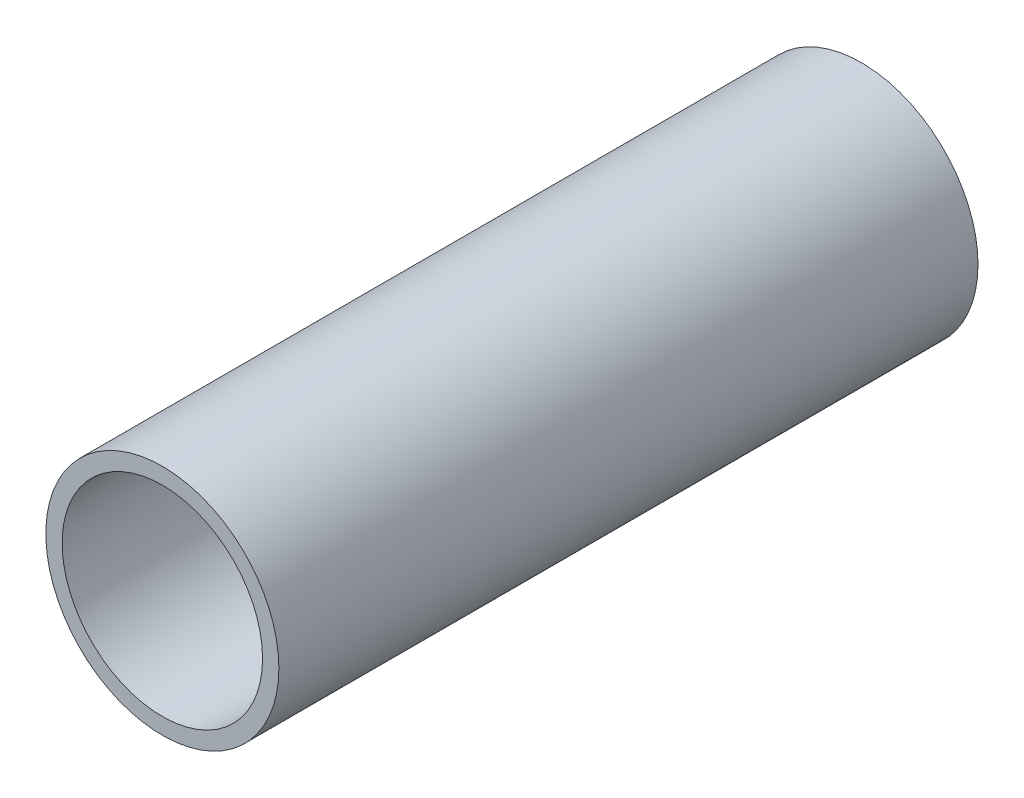
ISO-10303-21;
HEADER;
FILE_DESCRIPTION(('STEP AP214'),'2;1');
FILE_NAME('part.step','',(''),(''),'','','');
FILE_SCHEMA(('AUTOMOTIVE_DESIGN { 1 0 10303 214 1 1 1 1 }'));
ENDSEC;
DATA;
#1=APPLICATION_CONTEXT('core data for automotive mechanical design processes');
#2=APPLICATION_PROTOCOL_DEFINITION('international standard','automotive_design',2000,#1);
#3=PRODUCT_CONTEXT('',#1,'mechanical');
#4=PRODUCT('Part','Part','',(#3));
#5=PRODUCT_RELATED_PRODUCT_CATEGORY('part','',(#4));
#6=PRODUCT_DEFINITION_FORMATION('','',#4);
#7=PRODUCT_DEFINITION_CONTEXT('part definition',#1,'design');
#8=PRODUCT_DEFINITION('design','',#6,#7);
#9=PRODUCT_DEFINITION_SHAPE('','',#8);
#10=(LENGTH_UNIT() NAMED_UNIT(*) SI_UNIT(.MILLI.,.METRE.));
#11=(NAMED_UNIT(*) PLANE_ANGLE_UNIT() SI_UNIT($,.RADIAN.));
#12=(NAMED_UNIT(*) SI_UNIT($,.STERADIAN.) SOLID_ANGLE_UNIT());
#13=UNCERTAINTY_MEASURE_WITH_UNIT(LENGTH_MEASURE(1.E-05),#10,'distance_accuracy_value','');
#14=(GEOMETRIC_REPRESENTATION_CONTEXT(3) GLOBAL_UNCERTAINTY_ASSIGNED_CONTEXT((#13)) GLOBAL_UNIT_ASSIGNED_CONTEXT((#10,
#11,#12)) REPRESENTATION_CONTEXT('',''));
#15=CARTESIAN_POINT('',(0.,0.,0.));
#16=DIRECTION('',(0.,0.,1.));
#17=DIRECTION('',(1.,0.,0.));
#18=AXIS2_PLACEMENT_3D('',#15,#16,#17);
#19=CARTESIAN_POINT('',(0.,0.,38.1));
#20=DIRECTION('',(0.,0.,-1.));
#21=DIRECTION('',(-1.,0.,0.));
#22=AXIS2_PLACEMENT_3D('',#19,#20,#21);
#23=CYLINDRICAL_SURFACE('',#22,5.461);
#24=CARTESIAN_POINT('',(0.,-5.461,30.575));
#25=CARTESIAN_POINT('',(0.108491179154578,-5.46100223938956,30.5750030443358));
#26=CARTESIAN_POINT('',(0.216961048635089,-5.45773846887579,30.5661443732503));
#27=CARTESIAN_POINT('',(0.430668975561198,-5.44504371516819,30.5310793792461));
#28=CARTESIAN_POINT('',(0.535907330231654,-5.43561330095301,30.5048746567954));
#29=CARTESIAN_POINT('',(0.74003991624861,-5.41160028639268,30.4361619612842));
#30=CARTESIAN_POINT('',(0.838945632205151,-5.39702734411741,30.3936845369159));
#31=CARTESIAN_POINT('',(1.0282227072047,-5.36418849796975,30.2937838227913));
#32=CARTESIAN_POINT('',(1.11859188586085,-5.34592165432953,30.2363567286094));
#33=CARTESIAN_POINT('',(1.29191688691412,-5.30675604706477,30.1057370732668));
#34=CARTESIAN_POINT('',(1.37447791222339,-5.28578520274446,30.032042437963));
#35=CARTESIAN_POINT('',(1.5263838335753,-5.24393868438475,29.8720456387839));
#36=CARTESIAN_POINT('',(1.59572495122447,-5.22306303921336,29.7857398829259));
#37=CARTESIAN_POINT('',(1.72167571511299,-5.18294210411501,29.599180298446));
#38=CARTESIAN_POINT('',(1.77773750600785,-5.1637825010515,29.4985363414913));
#39=CARTESIAN_POINT('',(1.87196440094197,-5.13037895056659,29.2884352526025));
#40=CARTESIAN_POINT('',(1.91013627781836,-5.11613314340031,29.1789814743452));
#41=CARTESIAN_POINT('',(1.96595796341741,-5.09493820673969,28.9589023819991));
#42=CARTESIAN_POINT('',(1.98435850463217,-5.08772320236641,28.8484939329444));
#43=CARTESIAN_POINT('',(2.00246270555631,-5.08062674394286,28.6259388739682));
#44=CARTESIAN_POINT('',(2.00217363581966,-5.08074243813467,28.5137929569229));
#45=CARTESIAN_POINT('',(1.98348277458646,-5.08806422998194,28.2977077819827));
#46=CARTESIAN_POINT('',(1.96610816220022,-5.09486822011214,28.193663559153));
#47=CARTESIAN_POINT('',(1.91543258945748,-5.11413395542866,27.9900852341723));
#48=CARTESIAN_POINT('',(1.8821293426403,-5.12659651285562,27.8905517817617));
#49=CARTESIAN_POINT('',(1.7999547806136,-5.15602672826673,27.6966749352573));
#50=CARTESIAN_POINT('',(1.7508089263731,-5.17307288069246,27.6024603425425));
#51=CARTESIAN_POINT('',(1.638535328542,-5.20972199916762,27.4233114383435));
#52=CARTESIAN_POINT('',(1.57540291845724,-5.22932581766085,27.3383802383404));
#53=CARTESIAN_POINT('',(1.4321978565155,-5.27040948459133,27.1745034404436));
#54=CARTESIAN_POINT('',(1.35130081109236,-5.29192918644096,27.0962865357804));
#55=CARTESIAN_POINT('',(1.17728570725163,-5.33333947918591,26.9543183265342));
#56=CARTESIAN_POINT('',(1.08416594307532,-5.35322984206612,26.8905690443958));
#57=CARTESIAN_POINT('',(0.886559296206195,-5.38950386987367,26.778591347858));
#58=CARTESIAN_POINT('',(0.781930304371776,-5.40583397489143,26.7305951374218));
#59=CARTESIAN_POINT('',(0.565337186046532,-5.4327523874302,26.6531241613201));
#60=CARTESIAN_POINT('',(0.453376182832028,-5.44334312219322,26.6236415652072));
#61=CARTESIAN_POINT('',(0.231438010025861,-5.45716819459852,26.5854113358455));
#62=CARTESIAN_POINT('',(0.121651496236989,-5.46075057449371,26.5756817385615));
#63=CARTESIAN_POINT('',(-0.0980306351952367,-5.46122388338287,26.5743880048742));
#64=CARTESIAN_POINT('',(-0.207926225135362,-5.45811621526078,26.5828200600244));
#65=CARTESIAN_POINT('',(-0.420532609487839,-5.44578848874136,26.6168565685657));
#66=CARTESIAN_POINT('',(-0.523359409426412,-5.43679435894001,26.6418266824631));
#67=CARTESIAN_POINT('',(-0.723298895769758,-5.41382438256404,26.7074045701217));
#68=CARTESIAN_POINT('',(-0.820410836833405,-5.39984788785158,26.7480143784493));
#69=CARTESIAN_POINT('',(-1.00929827466281,-5.36780071334321,26.844996189869));
#70=CARTESIAN_POINT('',(-1.10083913633824,-5.34962359428052,26.901788948068));
#71=CARTESIAN_POINT('',(-1.27339154965867,-5.31119779335956,27.0290452196877));
#72=CARTESIAN_POINT('',(-1.35439932867276,-5.29094837388133,27.0995136089035));
#73=CARTESIAN_POINT('',(-1.50826525829655,-5.24922498579124,27.2567100740174));
#74=CARTESIAN_POINT('',(-1.58042534033367,-5.2277452042933,27.3441216461276));
#75=CARTESIAN_POINT('',(-1.70917944910057,-5.18708001418718,27.5302465011366));
#76=CARTESIAN_POINT('',(-1.76577241023928,-5.16789476269355,27.6289605570514));
#77=CARTESIAN_POINT('',(-1.86175863758426,-5.13410031540785,27.8355073177876));
#78=CARTESIAN_POINT('',(-1.90110769778134,-5.11950290764174,27.9433626228273));
#79=CARTESIAN_POINT('',(-1.96084433341598,-5.09692555269108,28.1648473177861));
#80=CARTESIAN_POINT('',(-1.98124290720843,-5.08894176742893,28.2784733181089));
#81=CARTESIAN_POINT('',(-2.00154177740892,-5.08098995122837,28.5007497087811));
#82=CARTESIAN_POINT('',(-2.00262533523918,-5.08055923805152,28.6092764523232));
#83=CARTESIAN_POINT('',(-1.98726894814168,-5.08658527787233,28.8248777450848));
#84=CARTESIAN_POINT('',(-1.97083051117601,-5.09304143817814,28.9319524184679));
#85=CARTESIAN_POINT('',(-1.92180124615361,-5.11173702032731,29.1386052574135));
#86=CARTESIAN_POINT('',(-1.88967130752248,-5.12381098431463,29.2383089970548));
#87=CARTESIAN_POINT('',(-1.81056913492781,-5.15229258994758,29.4309739493755));
#88=CARTESIAN_POINT('',(-1.7635932346924,-5.16870130191279,29.5239334895669));
#89=CARTESIAN_POINT('',(-1.65336920167476,-5.20503760461863,29.7055845457592));
#90=CARTESIAN_POINT('',(-1.58941765168616,-5.22510128962595,29.793821712823));
#91=CARTESIAN_POINT('',(-1.44816795133776,-5.26599768525611,29.9586912474642));
#92=CARTESIAN_POINT('',(-1.37086566048682,-5.28683063287132,30.0353200010211));
#93=CARTESIAN_POINT('',(-1.20042483162023,-5.32818545097307,30.178745068204));
#94=CARTESIAN_POINT('',(-1.1066825755437,-5.34863814271819,30.2448469480443));
#95=CARTESIAN_POINT('',(-0.908707931475497,-5.38580572290981,30.3603232509934));
#96=CARTESIAN_POINT('',(-0.804475539815672,-5.40252061004928,30.4096976682529));
#97=CARTESIAN_POINT('',(-0.585788005534008,-5.43063484324844,30.4909255295511));
#98=CARTESIAN_POINT('',(-0.471148400865916,-5.44189797665209,30.5223332433169));
#99=CARTESIAN_POINT('',(-0.237662750728607,-5.45707769895462,30.564364200503));
#100=CARTESIAN_POINT('',(-0.118818595484139,-5.46099754744003,30.57499666587));
#101=CARTESIAN_POINT('',(0.,-5.461,30.575));
#102=B_SPLINE_CURVE_WITH_KNOTS('',3,(#24,#25,#26,#27,#28,#29,#30,#31,#32,#33,#34,#35,#36,#37,
#38,#39,#40,#41,#42,#43,#44,#45,#46,#47,#48,#49,#50,#51,#52,#53,#54,#55,#56,#57,#58,#59,#60,#61,
#62,#63,#64,#65,#66,#67,#68,#69,#70,#71,#72,#73,#74,#75,#76,#77,#78,#79,#80,#81,#82,#83,#84,#85,
#86,#87,#88,#89,#90,#91,#92,#93,#94,#95,#96,#97,#98,#99,#100,#101),.UNSPECIFIED.,.T.,.F.,(4,2,2,
2,2,2,2,2,2,2,2,2,2,2,2,2,2,2,2,2,2,2,2,2,2,2,2,2,2,2,2,2,2,2,2,2,2,2,4),(0.,0.325035485459794,
0.650040985051903,0.974439319269884,1.2989202879437,1.63533301902956,1.97184175686376,
2.32045828299172,2.66894272161796,3.00366862406861,3.3382643136382,3.6539021013308,
3.96958521055328,4.29106284169025,4.61264789303976,4.95477117656569,5.29694225645355,
5.64395149492557,5.99081386466917,6.31996345341913,6.64904402716554,6.96618137042539,
7.28335998399854,7.60968485742597,7.93612629044886,8.28061354314366,8.62512437060534,
8.97051328287646,9.31570161521287,9.63966528093859,9.96360106824688,10.2785476004609,
10.5935719708855,10.9245452578261,11.2556213750811,11.6034634036284,11.951305553808,
12.3074397102256,12.6634157459346),.UNSPECIFIED.);
#103=CARTESIAN_POINT('',(0.,-5.461,30.575));
#104=VERTEX_POINT('',#103);
#105=EDGE_CURVE('E63',#104,#104,#102,.T.);
#106=ORIENTED_EDGE('',*,*,#105,.F.);
#107=EDGE_LOOP('',(#106));
#108=FACE_BOUND('',#107,.T.);
#109=CARTESIAN_POINT('',(0.,-5.461,11.525));
#110=CARTESIAN_POINT('',(0.108491179154579,-5.46100223938956,11.5250030443358));
#111=CARTESIAN_POINT('',(0.21696104863509,-5.45773846887579,11.5161443732503));
#112=CARTESIAN_POINT('',(0.430668975561199,-5.44504371516819,11.4810793792461));
#113=CARTESIAN_POINT('',(0.535907330231654,-5.43561330095301,11.4548746567954));
#114=CARTESIAN_POINT('',(0.740039916248611,-5.41160028639268,11.3861619612842));
#115=CARTESIAN_POINT('',(0.838945632205152,-5.39702734411741,11.3436845369159));
#116=CARTESIAN_POINT('',(1.0282227072047,-5.36418849796975,11.2437838227913));
#117=CARTESIAN_POINT('',(1.11859188586085,-5.34592165432953,11.1863567286094));
#118=CARTESIAN_POINT('',(1.29191688691412,-5.30675604706476,11.0557370732668));
#119=CARTESIAN_POINT('',(1.37447791222339,-5.28578520274446,10.982042437963));
#120=CARTESIAN_POINT('',(1.5263838335753,-5.24393868438475,10.8220456387839));
#121=CARTESIAN_POINT('',(1.59572495122447,-5.22306303921336,10.7357398829259));
#122=CARTESIAN_POINT('',(1.72167571511299,-5.18294210411501,10.549180298446));
#123=CARTESIAN_POINT('',(1.77773750600785,-5.1637825010515,10.4485363414913));
#124=CARTESIAN_POINT('',(1.87196440094197,-5.13037895056659,10.2384352526025));
#125=CARTESIAN_POINT('',(1.91013627781836,-5.11613314340031,10.1289814743452));
#126=CARTESIAN_POINT('',(1.96595796341741,-5.09493820673969,9.9089023819991));
#127=CARTESIAN_POINT('',(1.98435850463217,-5.08772320236641,9.7984939329444));
#128=CARTESIAN_POINT('',(2.00246270555631,-5.08062674394286,9.57593887396818));
#129=CARTESIAN_POINT('',(2.00217363581966,-5.08074243813467,9.4637929569229));
#130=CARTESIAN_POINT('',(1.98348277458646,-5.08806422998194,9.24770778198275));
#131=CARTESIAN_POINT('',(1.96610816220023,-5.09486822011214,9.14366355915301));
#132=CARTESIAN_POINT('',(1.91543258945748,-5.11413395542866,8.94008523417226));
#133=CARTESIAN_POINT('',(1.8821293426403,-5.12659651285562,8.84055178176172));
#134=CARTESIAN_POINT('',(1.7999547806136,-5.15602672826673,8.64667493525727));
#135=CARTESIAN_POINT('',(1.7508089263731,-5.17307288069246,8.55246034254245));
#136=CARTESIAN_POINT('',(1.638535328542,-5.20972199916762,8.37331143834355));
#137=CARTESIAN_POINT('',(1.57540291845724,-5.22932581766085,8.28838023834038));
#138=CARTESIAN_POINT('',(1.4321978565155,-5.27040948459133,8.12450344044362));
#139=CARTESIAN_POINT('',(1.35130081109235,-5.29192918644096,8.04628653578038));
#140=CARTESIAN_POINT('',(1.17728570725163,-5.33333947918591,7.90431832653424));
#141=CARTESIAN_POINT('',(1.08416594307532,-5.35322984206612,7.8405690443958));
#142=CARTESIAN_POINT('',(0.886559296206197,-5.38950386987367,7.728591347858));
#143=CARTESIAN_POINT('',(0.781930304371777,-5.40583397489143,7.68059513742183));
#144=CARTESIAN_POINT('',(0.565337186046533,-5.4327523874302,7.60312416132009));
#145=CARTESIAN_POINT('',(0.453376182832029,-5.44334312219322,7.57364156520723));
#146=CARTESIAN_POINT('',(0.231438010025862,-5.45716819459852,7.53541133584546));
#147=CARTESIAN_POINT('',(0.12165149623699,-5.46075057449371,7.52568173856152));
#148=CARTESIAN_POINT('',(-0.0980306351952351,-5.46122388338287,7.52438800487416));
#149=CARTESIAN_POINT('',(-0.207926225135361,-5.45811621526078,7.53282006002439));
#150=CARTESIAN_POINT('',(-0.420532609487837,-5.44578848874136,7.56685656856565));
#151=CARTESIAN_POINT('',(-0.52335940942641,-5.43679435894001,7.59182668246314));
#152=CARTESIAN_POINT('',(-0.723298895769756,-5.41382438256404,7.6574045701217));
#153=CARTESIAN_POINT('',(-0.820410836833404,-5.39984788785158,7.69801437844927));
#154=CARTESIAN_POINT('',(-1.00929827466281,-5.36780071334321,7.79499618986903));
#155=CARTESIAN_POINT('',(-1.10083913633824,-5.34962359428052,7.85178894806802));
#156=CARTESIAN_POINT('',(-1.27339154965867,-5.31119779335956,7.97904521968775));
#157=CARTESIAN_POINT('',(-1.35439932867276,-5.29094837388134,8.04951360890352));
#158=CARTESIAN_POINT('',(-1.50826525829655,-5.24922498579124,8.20671007401743));
#159=CARTESIAN_POINT('',(-1.58042534033367,-5.2277452042933,8.29412164612759));
#160=CARTESIAN_POINT('',(-1.70917944910057,-5.18708001418718,8.48024650113656));
#161=CARTESIAN_POINT('',(-1.76577241023928,-5.16789476269355,8.57896055705142));
#162=CARTESIAN_POINT('',(-1.86175863758426,-5.13410031540785,8.78550731778756));
#163=CARTESIAN_POINT('',(-1.90110769778134,-5.11950290764174,8.89336262282728));
#164=CARTESIAN_POINT('',(-1.96084433341598,-5.09692555269108,9.11484731778612));
#165=CARTESIAN_POINT('',(-1.98124290720843,-5.08894176742893,9.22847331810889));
#166=CARTESIAN_POINT('',(-2.00154177740892,-5.08098995122837,9.45074970878109));
#167=CARTESIAN_POINT('',(-2.00262533523918,-5.08055923805152,9.5592764523232));
#168=CARTESIAN_POINT('',(-1.98726894814168,-5.08658527787233,9.77487774508479));
#169=CARTESIAN_POINT('',(-1.97083051117601,-5.09304143817814,9.88195241846794));
#170=CARTESIAN_POINT('',(-1.92180124615361,-5.11173702032731,10.0886052574135));
#171=CARTESIAN_POINT('',(-1.88967130752248,-5.12381098431463,10.1883089970548));
#172=CARTESIAN_POINT('',(-1.8105691349278,-5.15229258994758,10.3809739493755));
#173=CARTESIAN_POINT('',(-1.76359323469239,-5.16870130191279,10.4739334895669));
#174=CARTESIAN_POINT('',(-1.65336920167476,-5.20503760461863,10.6555845457592));
#175=CARTESIAN_POINT('',(-1.58941765168616,-5.22510128962595,10.743821712823));
#176=CARTESIAN_POINT('',(-1.44816795133775,-5.26599768525612,10.9086912474642));
#177=CARTESIAN_POINT('',(-1.37086566048682,-5.28683063287132,10.9853200010211));
#178=CARTESIAN_POINT('',(-1.20042483162023,-5.32818545097307,11.128745068204));
#179=CARTESIAN_POINT('',(-1.1066825755437,-5.34863814271819,11.1948469480443));
#180=CARTESIAN_POINT('',(-0.908707931475494,-5.38580572290981,11.3103232509934));
#181=CARTESIAN_POINT('',(-0.804475539815669,-5.40252061004928,11.3596976682529));
#182=CARTESIAN_POINT('',(-0.585788005534006,-5.43063484324845,11.4409255295511));
#183=CARTESIAN_POINT('',(-0.471148400865914,-5.44189797665209,11.4723332433169));
#184=CARTESIAN_POINT('',(-0.237662750728605,-5.45707769895462,11.514364200503));
#185=CARTESIAN_POINT('',(-0.118818595484137,-5.46099754744003,11.52499666587));
#186=CARTESIAN_POINT('',(0.,-5.461,11.525));
#187=B_SPLINE_CURVE_WITH_KNOTS('',3,(#109,#110,#111,#112,#113,#114,#115,#116,#117,#118,#119,
#120,#121,#122,#123,#124,#125,#126,#127,#128,#129,#130,#131,#132,#133,#134,#135,#136,#137,#138,
#139,#140,#141,#142,#143,#144,#145,#146,#147,#148,#149,#150,#151,#152,#153,#154,#155,#156,#157,
#158,#159,#160,#161,#162,#163,#164,#165,#166,#167,#168,#169,#170,#171,#172,#173,#174,#175,#176,
#177,#178,#179,#180,#181,#182,#183,#184,#185,#186),.UNSPECIFIED.,.T.,.F.,(4,2,2,2,2,2,2,2,2,2,2,
2,2,2,2,2,2,2,2,2,2,2,2,2,2,2,2,2,2,2,2,2,2,2,2,2,2,2,4),(0.,0.325035485459794,
0.650040985051903,0.974439319269884,1.2989202879437,1.63533301902956,1.97184175686376,
2.32045828299172,2.66894272161796,3.00366862406862,3.3382643136382,3.6539021013308,
3.96958521055327,4.29106284169025,4.61264789303976,4.95477117656569,5.29694225645355,
5.64395149492557,5.99081386466917,6.31996345341912,6.64904402716554,6.96618137042539,
7.28335998399854,7.60968485742597,7.93612629044886,8.28061354314366,8.62512437060534,
8.97051328287646,9.31570161521287,9.63966528093859,9.96360106824688,10.2785476004609,
10.5935719708855,10.9245452578261,11.2556213750811,11.6034634036284,11.951305553808,
12.3074397102256,12.6634157459346),.UNSPECIFIED.);
#188=CARTESIAN_POINT('',(0.,-5.461,11.525));
#189=VERTEX_POINT('',#188);
#190=EDGE_CURVE('E56',#189,#189,#187,.T.);
#191=ORIENTED_EDGE('',*,*,#190,.F.);
#192=EDGE_LOOP('',(#191));
#193=FACE_BOUND('',#192,.T.);
#194=CARTESIAN_POINT('',(0.,0.,38.1));
#195=DIRECTION('',(0.,0.,1.));
#196=DIRECTION('',(1.,0.,0.));
#197=AXIS2_PLACEMENT_3D('',#194,#195,#196);
#198=CIRCLE('',#197,5.461);
#199=CARTESIAN_POINT('',(5.461,0.,38.1));
#200=VERTEX_POINT('',#199);
#201=EDGE_CURVE('E44',#200,#200,#198,.T.);
#202=ORIENTED_EDGE('',*,*,#201,.T.);
#203=EDGE_LOOP('',(#202));
#204=FACE_BOUND('',#203,.T.);
#205=CARTESIAN_POINT('',(0.,0.,0.));
#206=DIRECTION('',(0.,0.,1.));
#207=DIRECTION('',(1.,0.,0.));
#208=AXIS2_PLACEMENT_3D('',#205,#206,#207);
#209=CIRCLE('',#208,5.461);
#210=CARTESIAN_POINT('',(5.461,0.,0.));
#211=VERTEX_POINT('',#210);
#212=EDGE_CURVE('E53',#211,#211,#209,.T.);
#213=ORIENTED_EDGE('',*,*,#212,.F.);
#214=EDGE_LOOP('',(#213));
#215=FACE_BOUND('',#214,.T.);
#216=ADVANCED_FACE('F33',(#108,#193,#204,#215),#23,.F.);
#217=CARTESIAN_POINT('',(0.,0.,38.1));
#218=DIRECTION('',(0.,0.,-1.));
#219=DIRECTION('',(-1.,0.,0.));
#220=AXIS2_PLACEMENT_3D('',#217,#218,#219);
#221=CYLINDRICAL_SURFACE('',#220,6.35);
#222=CARTESIAN_POINT('',(0.,-6.35,30.575));
#223=CARTESIAN_POINT('',(0.109459382542907,-6.34999954177387,30.5749994164505));
#224=CARTESIAN_POINT('',(0.218925049959982,-6.34714311321166,30.5659844128984));
#225=CARTESIAN_POINT('',(0.434652473788956,-6.33602827356407,30.5302589175087));
#226=CARTESIAN_POINT('',(0.540913545874182,-6.32776871709148,30.5035446736654));
#227=CARTESIAN_POINT('',(0.747089875657803,-6.30674936557198,30.433412839271));
#228=CARTESIAN_POINT('',(0.847014764673544,-6.2939966038065,30.3900213442808));
#229=CARTESIAN_POINT('',(1.03817017833074,-6.26530583445687,30.287878559723));
#230=CARTESIAN_POINT('',(1.12939928812193,-6.24936730983396,30.2291247764294));
#231=CARTESIAN_POINT('',(1.30343118018697,-6.21543683798116,30.0959886387944));
#232=CARTESIAN_POINT('',(1.38592345094522,-6.19739963027479,30.0212119736439));
#233=CARTESIAN_POINT('',(1.53742831833673,-6.16156531174633,29.858992127567));
#234=CARTESIAN_POINT('',(1.60643835501439,-6.14376824711775,29.7715465465938));
#235=CARTESIAN_POINT('',(1.73071363408787,-6.10994220236163,29.5837707062383));
#236=CARTESIAN_POINT('',(1.78558916761595,-6.09396900491067,29.4831715227718));
#237=CARTESIAN_POINT('',(1.87751386092633,-6.06628083683232,29.273588013396));
#238=CARTESIAN_POINT('',(1.91456780104787,-6.05456472452069,29.1646059451607));
#239=CARTESIAN_POINT('',(1.96865797245166,-6.03719105635796,28.9448574324552));
#240=CARTESIAN_POINT('',(1.98627089440143,-6.03135942687503,28.8342470865849));
#241=CARTESIAN_POINT('',(2.00278087222624,-6.02589838737814,28.611499438398));
#242=CARTESIAN_POINT('',(2.00168299423813,-6.02626729850521,28.4993625576223));
#243=CARTESIAN_POINT('',(1.98125320609646,-6.03301213155008,28.281532037457));
#244=CARTESIAN_POINT('',(1.96265658538293,-6.03914580837347,28.1757606687388));
#245=CARTESIAN_POINT('',(1.90895021373769,-6.05633519979143,27.9689230657145));
#246=CARTESIAN_POINT('',(1.8738386824976,-6.06739144503234,27.8678573399681));
#247=CARTESIAN_POINT('',(1.78758434079555,-6.0933643515369,27.6715576691876));
#248=CARTESIAN_POINT('',(1.73621215869283,-6.10833567795451,27.5764320539873));
#249=CARTESIAN_POINT('',(1.6190540664784,-6.14042705773518,27.3959112784986));
#250=CARTESIAN_POINT('',(1.55326436261561,-6.15754767614423,27.3105186883145));
#251=CARTESIAN_POINT('',(1.40553948054554,-6.19297824394465,27.1477338767739));
#252=CARTESIAN_POINT('',(1.32299795804768,-6.2113065642987,27.0708948770763));
#253=CARTESIAN_POINT('',(1.14597287727255,-6.24638917019528,26.9320139239921));
#254=CARTESIAN_POINT('',(1.05148840693984,-6.26314333535266,26.8699731017542));
#255=CARTESIAN_POINT('',(0.852181054275976,-6.29337063173254,26.7620667906204));
#256=CARTESIAN_POINT('',(0.747281283701516,-6.30681635072294,26.7163351185409));
#257=CARTESIAN_POINT('',(0.530755398571081,-6.32871380255594,26.6433321461039));
#258=CARTESIAN_POINT('',(0.41913137167114,-6.33716707666897,26.6160551480299));
#259=CARTESIAN_POINT('',(0.197020017835358,-6.34787832908592,26.5816825321787));
#260=CARTESIAN_POINT('',(0.0866594761204077,-6.35036604099747,26.5738381508384));
#261=CARTESIAN_POINT('',(-0.133813926362038,-6.34954641773507,26.5764398014465));
#262=CARTESIAN_POINT('',(-0.243926821510503,-6.34623994398884,26.5868831145439));
#263=CARTESIAN_POINT('',(-0.457878637788791,-6.33435451969435,26.6251635385388));
#264=CARTESIAN_POINT('',(-0.561805824109794,-6.325911202165,26.6525534967289));
#265=CARTESIAN_POINT('',(-0.763559126456238,-6.30474229444981,26.7234025516334));
#266=CARTESIAN_POINT('',(-0.861384483733321,-6.29201617296049,26.7668636421191));
#267=CARTESIAN_POINT('',(-1.05083641206033,-6.26319856305455,26.8698162477041));
#268=CARTESIAN_POINT('',(-1.14225110153446,-6.24703194034033,26.9296760518015));
#269=CARTESIAN_POINT('',(-1.31398832981217,-6.21318025142311,27.0632861183055));
#270=CARTESIAN_POINT('',(-1.394307804701,-6.19549476796846,27.137040204344));
#271=CARTESIAN_POINT('',(-1.54493496266177,-6.15970098041184,27.2998673031687));
#272=CARTESIAN_POINT('',(-1.61470885314466,-6.1416043516294,27.3894378122509));
#273=CARTESIAN_POINT('',(-1.73828550034023,-6.10778048462924,27.5794090831817));
#274=CARTESIAN_POINT('',(-1.79208847266324,-6.09205321442616,27.679809698797));
#275=CARTESIAN_POINT('',(-1.88186972548412,-6.06492137157673,27.888409224334));
#276=CARTESIAN_POINT('',(-1.91791378151849,-6.05350088491069,27.9965776311165));
#277=CARTESIAN_POINT('',(-1.97114343438128,-6.03638058511951,28.2178829630451));
#278=CARTESIAN_POINT('',(-1.98833635449891,-6.03067855056365,28.3310179410006));
#279=CARTESIAN_POINT('',(-2.00284439370545,-6.02587471885277,28.553457549833));
#280=CARTESIAN_POINT('',(-2.00103634345504,-6.02648176413455,28.6626994025011));
#281=CARTESIAN_POINT('',(-1.97971522185172,-6.03351893966243,28.8792406125789));
#282=CARTESIAN_POINT('',(-1.96020300106662,-6.03994879016139,28.9865400630555));
#283=CARTESIAN_POINT('',(-1.90461841343822,-6.05770205715241,29.1945554397263));
#284=CARTESIAN_POINT('',(-1.86880073990097,-6.06895005951139,29.2953463480582));
#285=CARTESIAN_POINT('',(-1.78182311987174,-6.0950519726527,29.4895681563782));
#286=CARTESIAN_POINT('',(-1.7306600173762,-6.10990662507357,29.5829975373686));
#287=CARTESIAN_POINT('',(-1.61207166769779,-6.14228296482453,29.763855335519));
#288=CARTESIAN_POINT('',(-1.54408200610561,-6.15988705347009,29.850898871557));
#289=CARTESIAN_POINT('',(-1.39475914789555,-6.19540382399595,30.0126251607499));
#290=CARTESIAN_POINT('',(-1.31342235965995,-6.21331658777418,30.0873045759105));
#291=CARTESIAN_POINT('',(-1.13645022907771,-6.24814930497826,30.2246785891825));
#292=CARTESIAN_POINT('',(-1.04042842012035,-6.26501620684602,30.2868902911795));
#293=CARTESIAN_POINT('',(-0.838759092324702,-6.29518499838427,30.3942078809382));
#294=CARTESIAN_POINT('',(-0.733115228456041,-6.30848823421976,30.4393202306128));
#295=CARTESIAN_POINT('',(-0.523924084589957,-6.32915110555605,30.5080388110267));
#296=CARTESIAN_POINT('',(-0.420884380962412,-6.33690087757196,30.5330760227662));
#297=CARTESIAN_POINT('',(-0.211898004201454,-6.34732501355995,30.5665551568794));
#298=CARTESIAN_POINT('',(-0.105951946376476,-6.35000044354306,30.5750005648507));
#299=CARTESIAN_POINT('',(0.,-6.35,30.575));
#300=B_SPLINE_CURVE_WITH_KNOTS('',3,(#222,#223,#224,#225,#226,#227,#228,#229,#230,#231,#232,
#233,#234,#235,#236,#237,#238,#239,#240,#241,#242,#243,#244,#245,#246,#247,#248,#249,#250,#251,
#252,#253,#254,#255,#256,#257,#258,#259,#260,#261,#262,#263,#264,#265,#266,#267,#268,#269,#270,
#271,#272,#273,#274,#275,#276,#277,#278,#279,#280,#281,#282,#283,#284,#285,#286,#287,#288,#289,
#290,#291,#292,#293,#294,#295,#296,#297,#298,#299),.UNSPECIFIED.,.T.,.F.,(4,2,2,2,2,2,2,2,2,2,2,
2,2,2,2,2,2,2,2,2,2,2,2,2,2,2,2,2,2,2,2,2,2,2,2,2,2,2,4),(0.,0.327988650558007,
0.656046852642942,0.983593805173076,1.31119396071542,1.6480406473964,1.98495123122211,
2.33034249119075,2.67564105409013,3.01039595432063,3.34506021774285,3.66626171481526,
3.98749784536771,4.31348397544876,4.63955598702786,4.9807199943601,5.32191007136131,
5.66583848283943,6.00966066096294,6.34001323425943,6.67031669785623,6.99225602053112,
7.31423529613717,7.64414085870835,7.97413734250024,8.31743010871831,8.6607182402099,
9.00272515843012,9.34459916667784,9.67076879349641,9.99692275086076,10.3181482438305,
10.6394398466999,10.9734721104888,11.3075944078494,11.6528624869261,11.9979999574323,
12.3155454971876,12.6330243200048),.UNSPECIFIED.);
#301=CARTESIAN_POINT('',(0.,-6.35,30.575));
#302=VERTEX_POINT('',#301);
#303=EDGE_CURVE('E37',#302,#302,#300,.T.);
#304=ORIENTED_EDGE('',*,*,#303,.T.);
#305=EDGE_LOOP('',(#304));
#306=FACE_BOUND('',#305,.T.);
#307=CARTESIAN_POINT('',(0.,-6.35,11.525));
#308=CARTESIAN_POINT('',(0.109459382542908,-6.34999954177387,11.5249994164505));
#309=CARTESIAN_POINT('',(0.218925049959983,-6.34714311321166,11.5159844128984));
#310=CARTESIAN_POINT('',(0.434652473788956,-6.33602827356407,11.4802589175087));
#311=CARTESIAN_POINT('',(0.540913545874183,-6.32776871709148,11.4535446736654));
#312=CARTESIAN_POINT('',(0.747089875657804,-6.30674936557198,11.383412839271));
#313=CARTESIAN_POINT('',(0.847014764673545,-6.2939966038065,11.3400213442808));
#314=CARTESIAN_POINT('',(1.03817017833074,-6.26530583445687,11.237878559723));
#315=CARTESIAN_POINT('',(1.12939928812193,-6.24936730983396,11.1791247764294));
#316=CARTESIAN_POINT('',(1.30343118018697,-6.21543683798116,11.0459886387944));
#317=CARTESIAN_POINT('',(1.38592345094522,-6.19739963027479,10.9712119736439));
#318=CARTESIAN_POINT('',(1.53742831833673,-6.16156531174633,10.808992127567));
#319=CARTESIAN_POINT('',(1.60643835501439,-6.14376824711775,10.7215465465937));
#320=CARTESIAN_POINT('',(1.73071363408787,-6.10994220236164,10.5337707062383));
#321=CARTESIAN_POINT('',(1.78558916761595,-6.09396900491067,10.4331715227718));
#322=CARTESIAN_POINT('',(1.87751386092633,-6.06628083683232,10.223588013396));
#323=CARTESIAN_POINT('',(1.91456780104787,-6.05456472452069,10.1146059451607));
#324=CARTESIAN_POINT('',(1.96865797245166,-6.03719105635796,9.89485743245523));
#325=CARTESIAN_POINT('',(1.98627089440143,-6.03135942687503,9.78424708658491));
#326=CARTESIAN_POINT('',(2.00278087222624,-6.02589838737814,9.56149943839799));
#327=CARTESIAN_POINT('',(2.00168299423813,-6.02626729850521,9.4493625576223));
#328=CARTESIAN_POINT('',(1.98125320609646,-6.03301213155008,9.23153203745703));
#329=CARTESIAN_POINT('',(1.96265658538293,-6.03914580837347,9.12576066873881));
#330=CARTESIAN_POINT('',(1.90895021373769,-6.05633519979143,8.91892306571445));
#331=CARTESIAN_POINT('',(1.8738386824976,-6.06739144503234,8.8178573399681));
#332=CARTESIAN_POINT('',(1.78758434079555,-6.0933643515369,8.62155766918764));
#333=CARTESIAN_POINT('',(1.73621215869284,-6.10833567795451,8.52643205398725));
#334=CARTESIAN_POINT('',(1.6190540664784,-6.14042705773518,8.34591127849859));
#335=CARTESIAN_POINT('',(1.55326436261562,-6.15754767614423,8.26051868831451));
#336=CARTESIAN_POINT('',(1.40553948054554,-6.19297824394465,8.09773387677394));
#337=CARTESIAN_POINT('',(1.32299795804768,-6.2113065642987,8.0208948770763));
#338=CARTESIAN_POINT('',(1.14597287727256,-6.24638917019528,7.88201392399215));
#339=CARTESIAN_POINT('',(1.05148840693985,-6.26314333535266,7.81997310175418));
#340=CARTESIAN_POINT('',(0.852181054275979,-6.29337063173253,7.71206679062044));
#341=CARTESIAN_POINT('',(0.747281283701517,-6.30681635072294,7.66633511854089));
#342=CARTESIAN_POINT('',(0.530755398571081,-6.32871380255594,7.59333214610388));
#343=CARTESIAN_POINT('',(0.41913137167114,-6.33716707666897,7.5660551480299));
#344=CARTESIAN_POINT('',(0.197020017835358,-6.34787832908592,7.53168253217873));
#345=CARTESIAN_POINT('',(0.0866594761204083,-6.35036604099747,7.5238381508384));
#346=CARTESIAN_POINT('',(-0.133813926362036,-6.34954641773507,7.52643980144652));
#347=CARTESIAN_POINT('',(-0.243926821510502,-6.34623994398884,7.53688311454394));
#348=CARTESIAN_POINT('',(-0.45787863778879,-6.33435451969435,7.57516353853882));
#349=CARTESIAN_POINT('',(-0.561805824109793,-6.325911202165,7.60255349672888));
#350=CARTESIAN_POINT('',(-0.763559126456237,-6.30474229444981,7.67340255163337));
#351=CARTESIAN_POINT('',(-0.86138448373332,-6.29201617296049,7.71686364211909));
#352=CARTESIAN_POINT('',(-1.05083641206033,-6.26319856305455,7.81981624770413));
#353=CARTESIAN_POINT('',(-1.14225110153446,-6.24703194034033,7.87967605180154));
#354=CARTESIAN_POINT('',(-1.31398832981217,-6.21318025142311,8.01328611830548));
#355=CARTESIAN_POINT('',(-1.394307804701,-6.19549476796846,8.08704020434404));
#356=CARTESIAN_POINT('',(-1.54493496266177,-6.15970098041184,8.24986730316873));
#357=CARTESIAN_POINT('',(-1.61470885314466,-6.1416043516294,8.33943781225089));
#358=CARTESIAN_POINT('',(-1.73828550034023,-6.10778048462924,8.52940908318169));
#359=CARTESIAN_POINT('',(-1.79208847266324,-6.09205321442616,8.62980969879696));
#360=CARTESIAN_POINT('',(-1.88186972548412,-6.06492137157673,8.83840922433402));
#361=CARTESIAN_POINT('',(-1.91791378151849,-6.05350088491069,8.94657763111647));
#362=CARTESIAN_POINT('',(-1.97114343438127,-6.03638058511952,9.16788296304509));
#363=CARTESIAN_POINT('',(-1.98833635449891,-6.03067855056365,9.28101794100063));
#364=CARTESIAN_POINT('',(-2.00284439370545,-6.02587471885277,9.50345754983298));
#365=CARTESIAN_POINT('',(-2.00103634345503,-6.02648176413455,9.61269940250111));
#366=CARTESIAN_POINT('',(-1.97971522185172,-6.03351893966243,9.82924061257888));
#367=CARTESIAN_POINT('',(-1.96020300106662,-6.03994879016139,9.93654006305545));
#368=CARTESIAN_POINT('',(-1.90461841343822,-6.05770205715241,10.1445554397263));
#369=CARTESIAN_POINT('',(-1.86880073990096,-6.06895005951139,10.2453463480582));
#370=CARTESIAN_POINT('',(-1.78182311987174,-6.0950519726527,10.4395681563782));
#371=CARTESIAN_POINT('',(-1.7306600173762,-6.10990662507357,10.5329975373686));
#372=CARTESIAN_POINT('',(-1.61207166769779,-6.14228296482453,10.713855335519));
#373=CARTESIAN_POINT('',(-1.54408200610561,-6.15988705347009,10.800898871557));
#374=CARTESIAN_POINT('',(-1.39475914789555,-6.19540382399596,10.9626251607499));
#375=CARTESIAN_POINT('',(-1.31342235965995,-6.21331658777418,11.0373045759105));
#376=CARTESIAN_POINT('',(-1.1364502290777,-6.24814930497826,11.1746785891825));
#377=CARTESIAN_POINT('',(-1.04042842012034,-6.26501620684602,11.2368902911795));
#378=CARTESIAN_POINT('',(-0.8387590923247,-6.29518499838427,11.3442078809382));
#379=CARTESIAN_POINT('',(-0.733115228456039,-6.30848823421976,11.3893202306128));
#380=CARTESIAN_POINT('',(-0.523924084589955,-6.32915110555605,11.4580388110267));
#381=CARTESIAN_POINT('',(-0.420884380962411,-6.33690087757196,11.4830760227662));
#382=CARTESIAN_POINT('',(-0.211898004201452,-6.34732501355995,11.5165551568794));
#383=CARTESIAN_POINT('',(-0.105951946376474,-6.35000044354306,11.5250005648507));
#384=CARTESIAN_POINT('',(0.,-6.35,11.525));
#385=B_SPLINE_CURVE_WITH_KNOTS('',3,(#307,#308,#309,#310,#311,#312,#313,#314,#315,#316,#317,
#318,#319,#320,#321,#322,#323,#324,#325,#326,#327,#328,#329,#330,#331,#332,#333,#334,#335,#336,
#337,#338,#339,#340,#341,#342,#343,#344,#345,#346,#347,#348,#349,#350,#351,#352,#353,#354,#355,
#356,#357,#358,#359,#360,#361,#362,#363,#364,#365,#366,#367,#368,#369,#370,#371,#372,#373,#374,
#375,#376,#377,#378,#379,#380,#381,#382,#383,#384),.UNSPECIFIED.,.T.,.F.,(4,2,2,2,2,2,2,2,2,2,2,
2,2,2,2,2,2,2,2,2,2,2,2,2,2,2,2,2,2,2,2,2,2,2,2,2,2,2,4),(0.,0.327988650558007,
0.656046852642941,0.983593805173076,1.31119396071542,1.6480406473964,1.98495123122211,
2.33034249119075,2.67564105409013,3.01039595432063,3.34506021774285,3.66626171481526,
3.98749784536771,4.31348397544876,4.63955598702786,4.98071999436009,5.3219100713613,
5.66583848283943,6.00966066096294,6.34001323425943,6.67031669785622,6.99225602053112,
7.31423529613717,7.64414085870835,7.97413734250024,8.31743010871832,8.6607182402099,
9.00272515843012,9.34459916667784,9.67076879349641,9.99692275086076,10.3181482438305,
10.6394398466999,10.9734721104888,11.3075944078494,11.6528624869261,11.9979999574323,
12.3155454971876,12.6330243200048),.UNSPECIFIED.);
#386=CARTESIAN_POINT('',(0.,-6.35,11.525));
#387=VERTEX_POINT('',#386);
#388=EDGE_CURVE('E58',#387,#387,#385,.T.);
#389=ORIENTED_EDGE('',*,*,#388,.T.);
#390=EDGE_LOOP('',(#389));
#391=FACE_BOUND('',#390,.T.);
#392=CARTESIAN_POINT('',(0.,0.,38.1));
#393=DIRECTION('',(0.,0.,1.));
#394=DIRECTION('',(1.,0.,0.));
#395=AXIS2_PLACEMENT_3D('',#392,#393,#394);
#396=CIRCLE('',#395,6.35);
#397=CARTESIAN_POINT('',(6.35,0.,38.1));
#398=VERTEX_POINT('',#397);
#399=EDGE_CURVE('E10',#398,#398,#396,.T.);
#400=ORIENTED_EDGE('',*,*,#399,.F.);
#401=EDGE_LOOP('',(#400));
#402=FACE_BOUND('',#401,.T.);
#403=CARTESIAN_POINT('',(0.,0.,0.));
#404=DIRECTION('',(0.,0.,1.));
#405=DIRECTION('',(1.,0.,0.));
#406=AXIS2_PLACEMENT_3D('',#403,#404,#405);
#407=CIRCLE('',#406,6.35);
#408=CARTESIAN_POINT('',(6.35,0.,0.));
#409=VERTEX_POINT('',#408);
#410=EDGE_CURVE('E49',#409,#409,#407,.T.);
#411=ORIENTED_EDGE('',*,*,#410,.T.);
#412=EDGE_LOOP('',(#411));
#413=FACE_BOUND('',#412,.T.);
#414=ADVANCED_FACE('F64',(#306,#391,#402,#413),#221,.T.);
#415=CARTESIAN_POINT('',(0.,-14.1114213562373,38.1));
#416=DIRECTION('',(0.,0.,1.));
#417=DIRECTION('',(1.,0.,0.));
#418=AXIS2_PLACEMENT_3D('',#415,#416,#417);
#419=PLANE('',#418);
#420=ORIENTED_EDGE('',*,*,#201,.F.);
#421=EDGE_LOOP('',(#420));
#422=FACE_BOUND('',#421,.T.);
#423=ORIENTED_EDGE('',*,*,#399,.T.);
#424=EDGE_LOOP('',(#423));
#425=FACE_BOUND('',#424,.T.);
#426=ADVANCED_FACE('F75',(#422,#425),#419,.T.);
#427=CARTESIAN_POINT('',(0.,-14.1114213562373,0.));
#428=DIRECTION('',(0.,0.,1.));
#429=DIRECTION('',(1.,0.,0.));
#430=AXIS2_PLACEMENT_3D('',#427,#428,#429);
#431=PLANE('',#430);
#432=ORIENTED_EDGE('',*,*,#212,.T.);
#433=EDGE_LOOP('',(#432));
#434=FACE_BOUND('',#433,.T.);
#435=ORIENTED_EDGE('',*,*,#410,.F.);
#436=EDGE_LOOP('',(#435));
#437=FACE_BOUND('',#436,.T.);
#438=ADVANCED_FACE('F72',(#434,#437),#431,.F.);
#439=CARTESIAN_POINT('',(0.,-10.,9.525));
#440=DIRECTION('',(0.,1.,0.));
#441=DIRECTION('',(0.,0.,1.));
#442=AXIS2_PLACEMENT_3D('',#439,#440,#441);
#443=CYLINDRICAL_SURFACE('',#442,2.);
#444=ORIENTED_EDGE('',*,*,#190,.T.);
#445=EDGE_LOOP('',(#444));
#446=FACE_BOUND('',#445,.T.);
#447=ORIENTED_EDGE('',*,*,#388,.F.);
#448=EDGE_LOOP('',(#447));
#449=FACE_BOUND('',#448,.T.);
#450=ADVANCED_FACE('F67',(#446,#449),#443,.F.);
#451=CARTESIAN_POINT('',(0.,-10.,28.575));
#452=DIRECTION('',(0.,1.,0.));
#453=DIRECTION('',(0.,0.,1.));
#454=AXIS2_PLACEMENT_3D('',#451,#452,#453);
#455=CYLINDRICAL_SURFACE('',#454,2.);
#456=ORIENTED_EDGE('',*,*,#105,.T.);
#457=EDGE_LOOP('',(#456));
#458=FACE_BOUND('',#457,.T.);
#459=ORIENTED_EDGE('',*,*,#303,.F.);
#460=EDGE_LOOP('',(#459));
#461=FACE_BOUND('',#460,.T.);
#462=ADVANCED_FACE('F71',(#458,#461),#455,.F.);
#463=CLOSED_SHELL('',(#216,#414,#426,#438,#450,#462));
#464=MANIFOLD_SOLID_BREP('B2',#463);
#465=ADVANCED_BREP_SHAPE_REPRESENTATION('',(#18,#464),#14);
#466=SHAPE_DEFINITION_REPRESENTATION(#9,#465);
ENDSEC;
END-ISO-10303-21;
